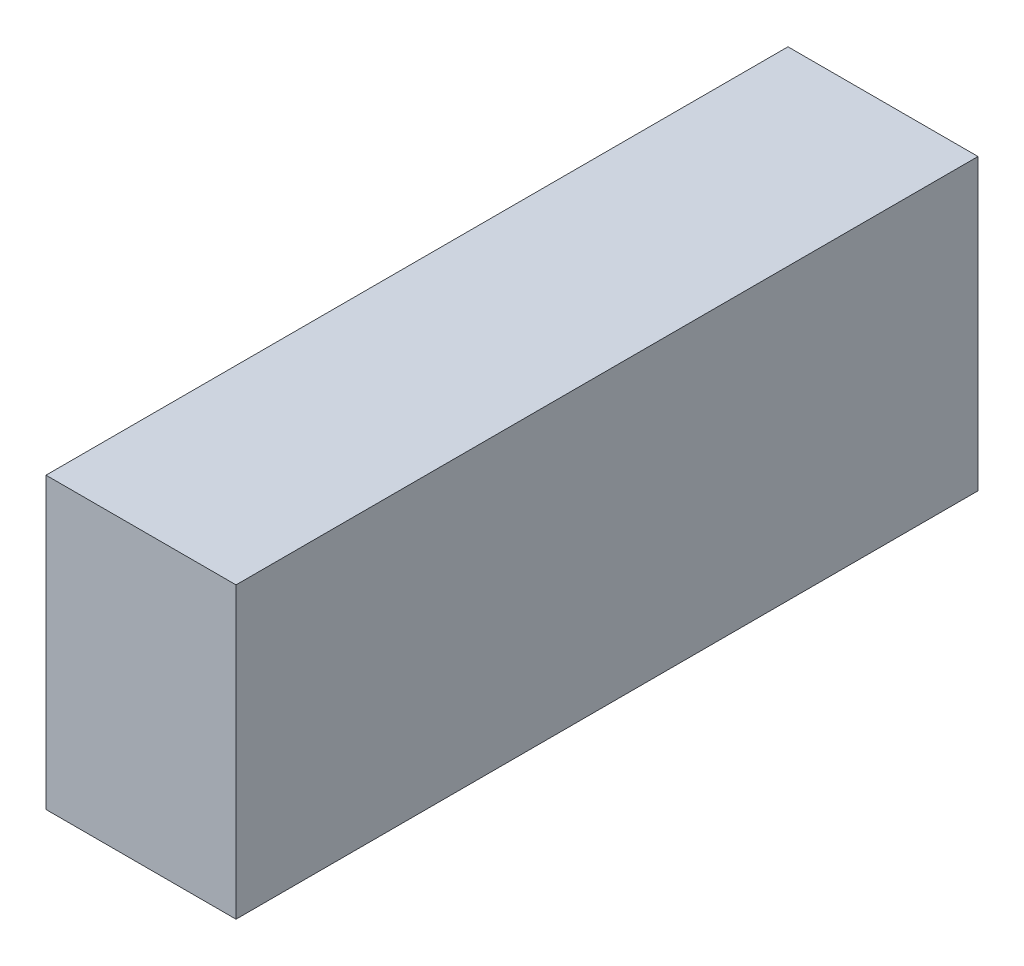
ISO-10303-21;
HEADER;
FILE_DESCRIPTION(('STEP AP214'),'2;1');
FILE_NAME('part.step','',(''),(''),'','','');
FILE_SCHEMA(('AUTOMOTIVE_DESIGN { 1 0 10303 214 1 1 1 1 }'));
ENDSEC;
DATA;
#1=APPLICATION_CONTEXT('core data for automotive mechanical design processes');
#2=APPLICATION_PROTOCOL_DEFINITION('international standard','automotive_design',2000,#1);
#3=PRODUCT_CONTEXT('',#1,'mechanical');
#4=PRODUCT('Part','Part','',(#3));
#5=PRODUCT_RELATED_PRODUCT_CATEGORY('part','',(#4));
#6=PRODUCT_DEFINITION_FORMATION('','',#4);
#7=PRODUCT_DEFINITION_CONTEXT('part definition',#1,'design');
#8=PRODUCT_DEFINITION('design','',#6,#7);
#9=PRODUCT_DEFINITION_SHAPE('','',#8);
#10=(LENGTH_UNIT() NAMED_UNIT(*) SI_UNIT(.MILLI.,.METRE.));
#11=(NAMED_UNIT(*) PLANE_ANGLE_UNIT() SI_UNIT($,.RADIAN.));
#12=(NAMED_UNIT(*) SI_UNIT($,.STERADIAN.) SOLID_ANGLE_UNIT());
#13=UNCERTAINTY_MEASURE_WITH_UNIT(LENGTH_MEASURE(1.E-05),#10,'distance_accuracy_value','');
#14=(GEOMETRIC_REPRESENTATION_CONTEXT(3) GLOBAL_UNCERTAINTY_ASSIGNED_CONTEXT((#13)) GLOBAL_UNIT_ASSIGNED_CONTEXT((#10,
#11,#12)) REPRESENTATION_CONTEXT('',''));
#15=CARTESIAN_POINT('',(0.,0.,0.));
#16=DIRECTION('',(0.,0.,1.));
#17=DIRECTION('',(1.,0.,0.));
#18=AXIS2_PLACEMENT_3D('',#15,#16,#17);
#19=CARTESIAN_POINT('',(21.,32.,164.));
#20=DIRECTION('',(-1.,0.,0.));
#21=DIRECTION('',(0.,-1.,0.));
#22=AXIS2_PLACEMENT_3D('',#19,#20,#21);
#23=PLANE('',#22);
#24=DIRECTION('',(0.,1.,0.));
#25=VECTOR('',#24,1.);
#26=CARTESIAN_POINT('',(21.,32.,0.));
#27=LINE('',#26,#25);
#28=CARTESIAN_POINT('',(21.,-32.,0.));
#29=VERTEX_POINT('',#28);
#30=CARTESIAN_POINT('',(21.,32.,0.));
#31=VERTEX_POINT('',#30);
#32=EDGE_CURVE('E107',#29,#31,#27,.T.);
#33=ORIENTED_EDGE('',*,*,#32,.T.);
#34=DIRECTION('',(0.,0.,-1.));
#35=VECTOR('',#34,1.);
#36=CARTESIAN_POINT('',(21.,32.,164.));
#37=LINE('',#36,#35);
#38=CARTESIAN_POINT('',(21.,32.,164.));
#39=VERTEX_POINT('',#38);
#40=EDGE_CURVE('E11',#39,#31,#37,.T.);
#41=ORIENTED_EDGE('',*,*,#40,.F.);
#42=DIRECTION('',(0.,1.,0.));
#43=VECTOR('',#42,1.);
#44=CARTESIAN_POINT('',(21.,32.,164.));
#45=LINE('',#44,#43);
#46=CARTESIAN_POINT('',(21.,-32.,164.));
#47=VERTEX_POINT('',#46);
#48=EDGE_CURVE('E91',#47,#39,#45,.T.);
#49=ORIENTED_EDGE('',*,*,#48,.F.);
#50=DIRECTION('',(0.,0.,-1.));
#51=VECTOR('',#50,1.);
#52=CARTESIAN_POINT('',(21.,-32.,164.));
#53=LINE('',#52,#51);
#54=EDGE_CURVE('E103',#47,#29,#53,.T.);
#55=ORIENTED_EDGE('',*,*,#54,.T.);
#56=EDGE_LOOP('',(#33,#41,#49,#55));
#57=FACE_BOUND('',#56,.T.);
#58=ADVANCED_FACE('F39',(#57),#23,.F.);
#59=CARTESIAN_POINT('',(-21.,32.,164.));
#60=DIRECTION('',(0.,-1.,0.));
#61=DIRECTION('',(0.,0.,-1.));
#62=AXIS2_PLACEMENT_3D('',#59,#60,#61);
#63=PLANE('',#62);
#64=DIRECTION('',(-1.,0.,0.));
#65=VECTOR('',#64,1.);
#66=CARTESIAN_POINT('',(-21.,32.,0.));
#67=LINE('',#66,#65);
#68=CARTESIAN_POINT('',(-21.,32.,0.));
#69=VERTEX_POINT('',#68);
#70=EDGE_CURVE('E96',#31,#69,#67,.T.);
#71=ORIENTED_EDGE('',*,*,#70,.T.);
#72=DIRECTION('',(0.,0.,-1.));
#73=VECTOR('',#72,1.);
#74=CARTESIAN_POINT('',(-21.,32.,164.));
#75=LINE('',#74,#73);
#76=CARTESIAN_POINT('',(-21.,32.,164.));
#77=VERTEX_POINT('',#76);
#78=EDGE_CURVE('E48',#77,#69,#75,.T.);
#79=ORIENTED_EDGE('',*,*,#78,.F.);
#80=DIRECTION('',(-1.,0.,0.));
#81=VECTOR('',#80,1.);
#82=CARTESIAN_POINT('',(-21.,32.,164.));
#83=LINE('',#82,#81);
#84=EDGE_CURVE('E86',#39,#77,#83,.T.);
#85=ORIENTED_EDGE('',*,*,#84,.F.);
#86=ORIENTED_EDGE('',*,*,#40,.T.);
#87=EDGE_LOOP('',(#71,#79,#85,#86));
#88=FACE_BOUND('',#87,.T.);
#89=ADVANCED_FACE('F95',(#88),#63,.F.);
#90=CARTESIAN_POINT('',(-21.,32.,164.));
#91=DIRECTION('',(1.,0.,0.));
#92=DIRECTION('',(0.,1.,0.));
#93=AXIS2_PLACEMENT_3D('',#90,#91,#92);
#94=PLANE('',#93);
#95=DIRECTION('',(0.,-1.,0.));
#96=VECTOR('',#95,1.);
#97=CARTESIAN_POINT('',(-21.,32.,0.));
#98=LINE('',#97,#96);
#99=CARTESIAN_POINT('',(-21.,-32.,0.));
#100=VERTEX_POINT('',#99);
#101=EDGE_CURVE('E73',#69,#100,#98,.T.);
#102=ORIENTED_EDGE('',*,*,#101,.T.);
#103=DIRECTION('',(0.,0.,-1.));
#104=VECTOR('',#103,1.);
#105=CARTESIAN_POINT('',(-21.,-32.,164.));
#106=LINE('',#105,#104);
#107=CARTESIAN_POINT('',(-21.,-32.,164.));
#108=VERTEX_POINT('',#107);
#109=EDGE_CURVE('E98',#108,#100,#106,.T.);
#110=ORIENTED_EDGE('',*,*,#109,.F.);
#111=DIRECTION('',(0.,-1.,0.));
#112=VECTOR('',#111,1.);
#113=CARTESIAN_POINT('',(-21.,32.,164.));
#114=LINE('',#113,#112);
#115=EDGE_CURVE('E89',#77,#108,#114,.T.);
#116=ORIENTED_EDGE('',*,*,#115,.F.);
#117=ORIENTED_EDGE('',*,*,#78,.T.);
#118=EDGE_LOOP('',(#102,#110,#116,#117));
#119=FACE_BOUND('',#118,.T.);
#120=ADVANCED_FACE('F99',(#119),#94,.F.);
#121=CARTESIAN_POINT('',(-21.,-32.,164.));
#122=DIRECTION('',(0.,1.,0.));
#123=DIRECTION('',(0.,0.,1.));
#124=AXIS2_PLACEMENT_3D('',#121,#122,#123);
#125=PLANE('',#124);
#126=DIRECTION('',(1.,0.,0.));
#127=VECTOR('',#126,1.);
#128=CARTESIAN_POINT('',(-21.,-32.,0.));
#129=LINE('',#128,#127);
#130=EDGE_CURVE('E79',#100,#29,#129,.T.);
#131=ORIENTED_EDGE('',*,*,#130,.T.);
#132=ORIENTED_EDGE('',*,*,#54,.F.);
#133=DIRECTION('',(1.,0.,0.));
#134=VECTOR('',#133,1.);
#135=CARTESIAN_POINT('',(-21.,-32.,164.));
#136=LINE('',#135,#134);
#137=EDGE_CURVE('E56',#108,#47,#136,.T.);
#138=ORIENTED_EDGE('',*,*,#137,.F.);
#139=ORIENTED_EDGE('',*,*,#109,.T.);
#140=EDGE_LOOP('',(#131,#132,#138,#139));
#141=FACE_BOUND('',#140,.T.);
#142=ADVANCED_FACE('F120',(#141),#125,.F.);
#143=CARTESIAN_POINT('',(0.,0.,164.));
#144=DIRECTION('',(0.,0.,1.));
#145=DIRECTION('',(1.,0.,0.));
#146=AXIS2_PLACEMENT_3D('',#143,#144,#145);
#147=PLANE('',#146);
#148=ORIENTED_EDGE('',*,*,#48,.T.);
#149=ORIENTED_EDGE('',*,*,#84,.T.);
#150=ORIENTED_EDGE('',*,*,#115,.T.);
#151=ORIENTED_EDGE('',*,*,#137,.T.);
#152=EDGE_LOOP('',(#148,#149,#150,#151));
#153=FACE_BOUND('',#152,.T.);
#154=ADVANCED_FACE('F87',(#153),#147,.T.);
#155=CARTESIAN_POINT('',(0.,0.,0.));
#156=DIRECTION('',(0.,0.,1.));
#157=DIRECTION('',(1.,0.,0.));
#158=AXIS2_PLACEMENT_3D('',#155,#156,#157);
#159=PLANE('',#158);
#160=ORIENTED_EDGE('',*,*,#32,.F.);
#161=ORIENTED_EDGE('',*,*,#130,.F.);
#162=ORIENTED_EDGE('',*,*,#101,.F.);
#163=ORIENTED_EDGE('',*,*,#70,.F.);
#164=EDGE_LOOP('',(#160,#161,#162,#163));
#165=FACE_BOUND('',#164,.T.);
#166=ADVANCED_FACE('F123',(#165),#159,.F.);
#167=CLOSED_SHELL('',(#58,#89,#120,#142,#154,#166));
#168=MANIFOLD_SOLID_BREP('B2',#167);
#169=ADVANCED_BREP_SHAPE_REPRESENTATION('',(#18,#168),#14);
#170=SHAPE_DEFINITION_REPRESENTATION(#9,#169);
ENDSEC;
END-ISO-10303-21;
